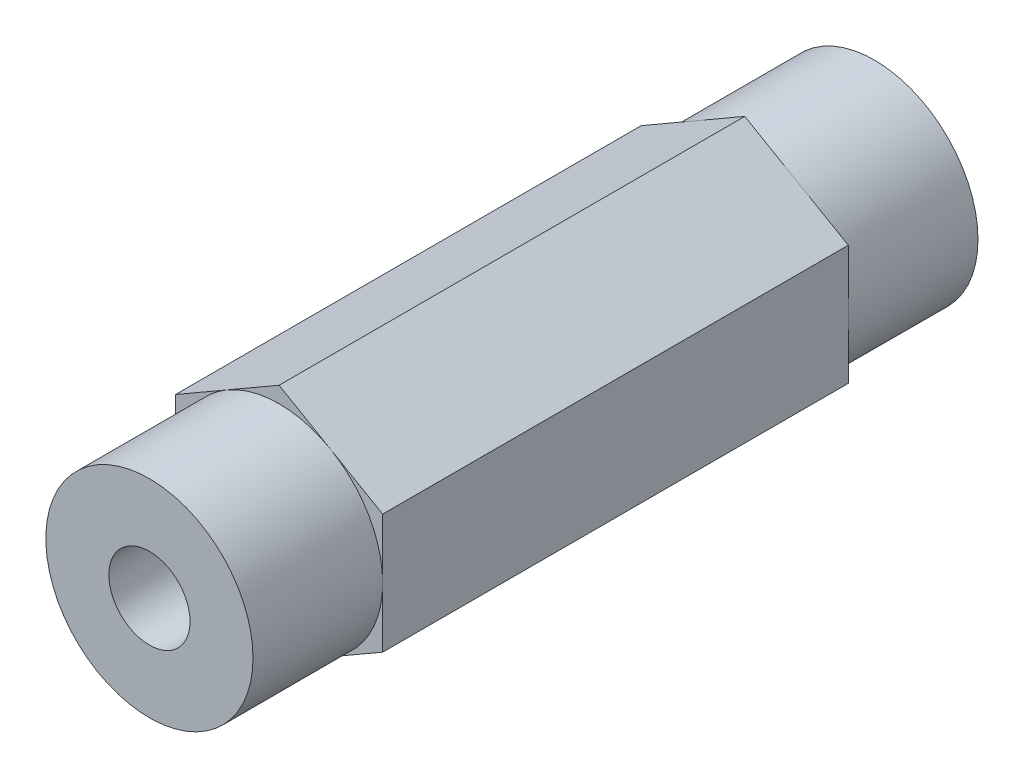
ISO-10303-21;
HEADER;
FILE_DESCRIPTION(('STEP AP214'),'2;1');
FILE_NAME('part.step','',(''),(''),'','','');
FILE_SCHEMA(('AUTOMOTIVE_DESIGN { 1 0 10303 214 1 1 1 1 }'));
ENDSEC;
DATA;
#1=APPLICATION_CONTEXT('core data for automotive mechanical design processes');
#2=APPLICATION_PROTOCOL_DEFINITION('international standard','automotive_design',2000,#1);
#3=PRODUCT_CONTEXT('',#1,'mechanical');
#4=PRODUCT('Part','Part','',(#3));
#5=PRODUCT_RELATED_PRODUCT_CATEGORY('part','',(#4));
#6=PRODUCT_DEFINITION_FORMATION('','',#4);
#7=PRODUCT_DEFINITION_CONTEXT('part definition',#1,'design');
#8=PRODUCT_DEFINITION('design','',#6,#7);
#9=PRODUCT_DEFINITION_SHAPE('','',#8);
#10=(LENGTH_UNIT() NAMED_UNIT(*) SI_UNIT(.MILLI.,.METRE.));
#11=(NAMED_UNIT(*) PLANE_ANGLE_UNIT() SI_UNIT($,.RADIAN.));
#12=(NAMED_UNIT(*) SI_UNIT($,.STERADIAN.) SOLID_ANGLE_UNIT());
#13=UNCERTAINTY_MEASURE_WITH_UNIT(LENGTH_MEASURE(1.E-05),#10,'distance_accuracy_value','');
#14=(GEOMETRIC_REPRESENTATION_CONTEXT(3) GLOBAL_UNCERTAINTY_ASSIGNED_CONTEXT((#13)) GLOBAL_UNIT_ASSIGNED_CONTEXT((#10,
#11,#12)) REPRESENTATION_CONTEXT('',''));
#15=CARTESIAN_POINT('',(0.,0.,0.));
#16=DIRECTION('',(0.,0.,1.));
#17=DIRECTION('',(1.,0.,0.));
#18=AXIS2_PLACEMENT_3D('',#15,#16,#17);
#19=CARTESIAN_POINT('',(0.,0.,-14.2748));
#20=DIRECTION('',(0.,0.,1.));
#21=DIRECTION('',(1.,0.,0.));
#22=AXIS2_PLACEMENT_3D('',#19,#20,#21);
#23=PLANE('',#22);
#24=DIRECTION('',(0.,1.,0.));
#25=VECTOR('',#24,1.);
#26=CARTESIAN_POINT('',(6.35,-3.66617420935413,-14.2748));
#27=LINE('',#26,#25);
#28=CARTESIAN_POINT('',(6.35,0.,-14.2748));
#29=VERTEX_POINT('',#28);
#30=CARTESIAN_POINT('',(6.35,3.66617420935412,-14.2748));
#31=VERTEX_POINT('',#30);
#32=EDGE_CURVE('E145',#29,#31,#27,.T.);
#33=ORIENTED_EDGE('',*,*,#32,.F.);
#34=CARTESIAN_POINT('',(0.,0.,-14.2748));
#35=DIRECTION('',(0.,0.,1.));
#36=DIRECTION('',(1.,0.,0.));
#37=AXIS2_PLACEMENT_3D('',#34,#35,#36);
#38=CIRCLE('',#37,6.35);
#39=CARTESIAN_POINT('',(3.175,5.49926131403119,-14.2748));
#40=VERTEX_POINT('',#39);
#41=EDGE_CURVE('E60',#29,#40,#38,.T.);
#42=ORIENTED_EDGE('',*,*,#41,.T.);
#43=DIRECTION('',(-0.866025403784439,0.5,0.));
#44=VECTOR('',#43,1.);
#45=CARTESIAN_POINT('',(6.35,3.66617420935412,-14.2748));
#46=LINE('',#45,#44);
#47=EDGE_CURVE('E144',#31,#40,#46,.T.);
#48=ORIENTED_EDGE('',*,*,#47,.F.);
#49=EDGE_LOOP('',(#33,#42,#48));
#50=FACE_BOUND('',#49,.T.);
#51=ADVANCED_FACE('F43',(#50),#23,.F.);
#52=CARTESIAN_POINT('',(0.,7.33234841870825,-14.2748));
#53=VERTEX_POINT('',#52);
#54=EDGE_CURVE('E150',#40,#53,#46,.T.);
#55=ORIENTED_EDGE('',*,*,#54,.F.);
#56=CARTESIAN_POINT('',(-3.175,5.49926131403119,-14.2748));
#57=VERTEX_POINT('',#56);
#58=EDGE_CURVE('E52',#40,#57,#38,.T.);
#59=ORIENTED_EDGE('',*,*,#58,.T.);
#60=DIRECTION('',(-0.866025403784439,-0.5,0.));
#61=VECTOR('',#60,1.);
#62=CARTESIAN_POINT('',(0.,7.33234841870825,-14.2748));
#63=LINE('',#62,#61);
#64=EDGE_CURVE('E153',#53,#57,#63,.T.);
#65=ORIENTED_EDGE('',*,*,#64,.F.);
#66=EDGE_LOOP('',(#55,#59,#65));
#67=FACE_BOUND('',#66,.T.);
#68=ADVANCED_FACE('F151',(#67),#23,.F.);
#69=CARTESIAN_POINT('',(-6.35,3.66617420935412,-14.2748));
#70=VERTEX_POINT('',#69);
#71=EDGE_CURVE('E163',#57,#70,#63,.T.);
#72=ORIENTED_EDGE('',*,*,#71,.F.);
#73=CARTESIAN_POINT('',(-6.35,0.,-14.2748));
#74=VERTEX_POINT('',#73);
#75=EDGE_CURVE('E134',#57,#74,#38,.T.);
#76=ORIENTED_EDGE('',*,*,#75,.T.);
#77=DIRECTION('',(0.,-1.,0.));
#78=VECTOR('',#77,1.);
#79=CARTESIAN_POINT('',(-6.35,3.66617420935412,-14.2748));
#80=LINE('',#79,#78);
#81=EDGE_CURVE('E170',#70,#74,#80,.T.);
#82=ORIENTED_EDGE('',*,*,#81,.F.);
#83=EDGE_LOOP('',(#72,#76,#82));
#84=FACE_BOUND('',#83,.T.);
#85=ADVANCED_FACE('F269',(#84),#23,.F.);
#86=CARTESIAN_POINT('',(-6.35,-3.66617420935412,-14.2748));
#87=VERTEX_POINT('',#86);
#88=EDGE_CURVE('E169',#74,#87,#80,.T.);
#89=ORIENTED_EDGE('',*,*,#88,.F.);
#90=CARTESIAN_POINT('',(-3.175,-5.49926131403118,-14.2748));
#91=VERTEX_POINT('',#90);
#92=EDGE_CURVE('E278',#74,#91,#38,.T.);
#93=ORIENTED_EDGE('',*,*,#92,.T.);
#94=DIRECTION('',(0.866025403784439,-0.5,0.));
#95=VECTOR('',#94,1.);
#96=CARTESIAN_POINT('',(-6.35,-3.66617420935412,-14.2748));
#97=LINE('',#96,#95);
#98=EDGE_CURVE('E174',#87,#91,#97,.T.);
#99=ORIENTED_EDGE('',*,*,#98,.F.);
#100=EDGE_LOOP('',(#89,#93,#99));
#101=FACE_BOUND('',#100,.T.);
#102=ADVANCED_FACE('F277',(#101),#23,.F.);
#103=CARTESIAN_POINT('',(0.,-7.33234841870825,-14.2748));
#104=VERTEX_POINT('',#103);
#105=EDGE_CURVE('E173',#91,#104,#97,.T.);
#106=ORIENTED_EDGE('',*,*,#105,.F.);
#107=CARTESIAN_POINT('',(3.175,-5.49926131403118,-14.2748));
#108=VERTEX_POINT('',#107);
#109=EDGE_CURVE('E220',#91,#108,#38,.T.);
#110=ORIENTED_EDGE('',*,*,#109,.T.);
#111=DIRECTION('',(0.866025403784439,0.5,0.));
#112=VECTOR('',#111,1.);
#113=CARTESIAN_POINT('',(0.,-7.33234841870825,-14.2748));
#114=LINE('',#113,#112);
#115=EDGE_CURVE('E178',#104,#108,#114,.T.);
#116=ORIENTED_EDGE('',*,*,#115,.F.);
#117=EDGE_LOOP('',(#106,#110,#116));
#118=FACE_BOUND('',#117,.T.);
#119=ADVANCED_FACE('F283',(#118),#23,.F.);
#120=CARTESIAN_POINT('',(0.,0.,14.2748));
#121=DIRECTION('',(0.,0.,1.));
#122=DIRECTION('',(1.,0.,0.));
#123=AXIS2_PLACEMENT_3D('',#120,#121,#122);
#124=PLANE('',#123);
#125=CARTESIAN_POINT('',(0.,0.,14.2748));
#126=DIRECTION('',(0.,0.,1.));
#127=DIRECTION('',(1.,0.,0.));
#128=AXIS2_PLACEMENT_3D('',#125,#126,#127);
#129=CIRCLE('',#128,6.35);
#130=CARTESIAN_POINT('',(6.35,0.,14.2748));
#131=VERTEX_POINT('',#130);
#132=CARTESIAN_POINT('',(3.175,5.49926131403119,14.2748));
#133=VERTEX_POINT('',#132);
#134=EDGE_CURVE('E203',#131,#133,#129,.T.);
#135=ORIENTED_EDGE('',*,*,#134,.F.);
#136=DIRECTION('',(0.,1.,0.));
#137=VECTOR('',#136,1.);
#138=CARTESIAN_POINT('',(6.35,-3.66617420935413,14.2748));
#139=LINE('',#138,#137);
#140=CARTESIAN_POINT('',(6.35,3.66617420935412,14.2748));
#141=VERTEX_POINT('',#140);
#142=EDGE_CURVE('E246',#131,#141,#139,.T.);
#143=ORIENTED_EDGE('',*,*,#142,.T.);
#144=DIRECTION('',(-0.866025403784439,0.5,0.));
#145=VECTOR('',#144,1.);
#146=CARTESIAN_POINT('',(6.35,3.66617420935412,14.2748));
#147=LINE('',#146,#145);
#148=EDGE_CURVE('E262',#141,#133,#147,.T.);
#149=ORIENTED_EDGE('',*,*,#148,.T.);
#150=EDGE_LOOP('',(#135,#143,#149));
#151=FACE_BOUND('',#150,.T.);
#152=ADVANCED_FACE('F261',(#151),#124,.T.);
#153=CARTESIAN_POINT('',(-3.175,5.49926131403118,14.2748));
#154=VERTEX_POINT('',#153);
#155=EDGE_CURVE('E211',#133,#154,#129,.T.);
#156=ORIENTED_EDGE('',*,*,#155,.F.);
#157=CARTESIAN_POINT('',(0.,7.33234841870825,14.2748));
#158=VERTEX_POINT('',#157);
#159=EDGE_CURVE('E183',#133,#158,#147,.T.);
#160=ORIENTED_EDGE('',*,*,#159,.T.);
#161=DIRECTION('',(-0.866025403784439,-0.5,0.));
#162=VECTOR('',#161,1.);
#163=CARTESIAN_POINT('',(0.,7.33234841870825,14.2748));
#164=LINE('',#163,#162);
#165=EDGE_CURVE('E234',#158,#154,#164,.T.);
#166=ORIENTED_EDGE('',*,*,#165,.T.);
#167=EDGE_LOOP('',(#156,#160,#166));
#168=FACE_BOUND('',#167,.T.);
#169=ADVANCED_FACE('F266',(#168),#124,.T.);
#170=CARTESIAN_POINT('',(-6.35,0.,14.2748));
#171=VERTEX_POINT('',#170);
#172=EDGE_CURVE('E218',#154,#171,#129,.T.);
#173=ORIENTED_EDGE('',*,*,#172,.F.);
#174=CARTESIAN_POINT('',(-6.35,3.66617420935412,14.2748));
#175=VERTEX_POINT('',#174);
#176=EDGE_CURVE('E239',#154,#175,#164,.T.);
#177=ORIENTED_EDGE('',*,*,#176,.T.);
#178=DIRECTION('',(0.,-1.,0.));
#179=VECTOR('',#178,1.);
#180=CARTESIAN_POINT('',(-6.35,3.66617420935412,14.2748));
#181=LINE('',#180,#179);
#182=EDGE_CURVE('E233',#175,#171,#181,.T.);
#183=ORIENTED_EDGE('',*,*,#182,.T.);
#184=EDGE_LOOP('',(#173,#177,#183));
#185=FACE_BOUND('',#184,.T.);
#186=ADVANCED_FACE('F237',(#185),#124,.T.);
#187=CARTESIAN_POINT('',(-3.175,-5.49926131403118,14.2748));
#188=VERTEX_POINT('',#187);
#189=EDGE_CURVE('E207',#171,#188,#129,.T.);
#190=ORIENTED_EDGE('',*,*,#189,.F.);
#191=CARTESIAN_POINT('',(-6.35,-3.66617420935412,14.2748));
#192=VERTEX_POINT('',#191);
#193=EDGE_CURVE('E227',#171,#192,#181,.T.);
#194=ORIENTED_EDGE('',*,*,#193,.T.);
#195=DIRECTION('',(0.866025403784439,-0.5,0.));
#196=VECTOR('',#195,1.);
#197=CARTESIAN_POINT('',(-6.35,-3.66617420935412,14.2748));
#198=LINE('',#197,#196);
#199=EDGE_CURVE('E230',#192,#188,#198,.T.);
#200=ORIENTED_EDGE('',*,*,#199,.T.);
#201=EDGE_LOOP('',(#190,#194,#200));
#202=FACE_BOUND('',#201,.T.);
#203=ADVANCED_FACE('F226',(#202),#124,.T.);
#204=CARTESIAN_POINT('',(3.175,-5.49926131403119,14.2748));
#205=VERTEX_POINT('',#204);
#206=EDGE_CURVE('E201',#188,#205,#129,.T.);
#207=ORIENTED_EDGE('',*,*,#206,.F.);
#208=CARTESIAN_POINT('',(0.,-7.33234841870825,14.2748));
#209=VERTEX_POINT('',#208);
#210=EDGE_CURVE('E240',#188,#209,#198,.T.);
#211=ORIENTED_EDGE('',*,*,#210,.T.);
#212=DIRECTION('',(0.866025403784439,0.5,0.));
#213=VECTOR('',#212,1.);
#214=CARTESIAN_POINT('',(0.,-7.33234841870825,14.2748));
#215=LINE('',#214,#213);
#216=EDGE_CURVE('E244',#209,#205,#215,.T.);
#217=ORIENTED_EDGE('',*,*,#216,.T.);
#218=EDGE_LOOP('',(#207,#211,#217));
#219=FACE_BOUND('',#218,.T.);
#220=ADVANCED_FACE('F285',(#219),#124,.T.);
#221=CARTESIAN_POINT('',(6.35,3.66617420935412,14.2748));
#222=DIRECTION('',(-0.5,-0.866025403784439,0.));
#223=DIRECTION('',(0.866025403784439,-0.5,0.));
#224=AXIS2_PLACEMENT_3D('',#221,#222,#223);
#225=PLANE('',#224);
#226=ORIENTED_EDGE('',*,*,#47,.T.);
#227=ORIENTED_EDGE('',*,*,#54,.T.);
#228=DIRECTION('',(0.,0.,-1.));
#229=VECTOR('',#228,1.);
#230=CARTESIAN_POINT('',(0.,7.33234841870825,14.2748));
#231=LINE('',#230,#229);
#232=EDGE_CURVE('E47',#158,#53,#231,.T.);
#233=ORIENTED_EDGE('',*,*,#232,.F.);
#234=ORIENTED_EDGE('',*,*,#159,.F.);
#235=ORIENTED_EDGE('',*,*,#148,.F.);
#236=DIRECTION('',(0.,0.,-1.));
#237=VECTOR('',#236,1.);
#238=CARTESIAN_POINT('',(6.35,3.66617420935412,14.2748));
#239=LINE('',#238,#237);
#240=EDGE_CURVE('E162',#141,#31,#239,.T.);
#241=ORIENTED_EDGE('',*,*,#240,.T.);
#242=EDGE_LOOP('',(#226,#227,#233,#234,#235,#241));
#243=FACE_BOUND('',#242,.T.);
#244=ADVANCED_FACE('F45',(#243),#225,.F.);
#245=CARTESIAN_POINT('',(0.,7.33234841870825,14.2748));
#246=DIRECTION('',(0.5,-0.866025403784439,0.));
#247=DIRECTION('',(0.866025403784439,0.5,0.));
#248=AXIS2_PLACEMENT_3D('',#245,#246,#247);
#249=PLANE('',#248);
#250=ORIENTED_EDGE('',*,*,#64,.T.);
#251=ORIENTED_EDGE('',*,*,#71,.T.);
#252=DIRECTION('',(0.,0.,-1.));
#253=VECTOR('',#252,1.);
#254=CARTESIAN_POINT('',(-6.35,3.66617420935412,14.2748));
#255=LINE('',#254,#253);
#256=EDGE_CURVE('E193',#175,#70,#255,.T.);
#257=ORIENTED_EDGE('',*,*,#256,.F.);
#258=ORIENTED_EDGE('',*,*,#176,.F.);
#259=ORIENTED_EDGE('',*,*,#165,.F.);
#260=ORIENTED_EDGE('',*,*,#232,.T.);
#261=EDGE_LOOP('',(#250,#251,#257,#258,#259,#260));
#262=FACE_BOUND('',#261,.T.);
#263=ADVANCED_FACE('F267',(#262),#249,.F.);
#264=CARTESIAN_POINT('',(-6.35,3.66617420935412,14.2748));
#265=DIRECTION('',(1.,0.,0.));
#266=DIRECTION('',(0.,1.,0.));
#267=AXIS2_PLACEMENT_3D('',#264,#265,#266);
#268=PLANE('',#267);
#269=ORIENTED_EDGE('',*,*,#81,.T.);
#270=ORIENTED_EDGE('',*,*,#88,.T.);
#271=DIRECTION('',(0.,0.,-1.));
#272=VECTOR('',#271,1.);
#273=CARTESIAN_POINT('',(-6.35,-3.66617420935412,14.2748));
#274=LINE('',#273,#272);
#275=EDGE_CURVE('E191',#192,#87,#274,.T.);
#276=ORIENTED_EDGE('',*,*,#275,.F.);
#277=ORIENTED_EDGE('',*,*,#193,.F.);
#278=ORIENTED_EDGE('',*,*,#182,.F.);
#279=ORIENTED_EDGE('',*,*,#256,.T.);
#280=EDGE_LOOP('',(#269,#270,#276,#277,#278,#279));
#281=FACE_BOUND('',#280,.T.);
#282=ADVANCED_FACE('F232',(#281),#268,.F.);
#283=CARTESIAN_POINT('',(-6.35,-3.66617420935412,14.2748));
#284=DIRECTION('',(0.5,0.866025403784439,0.));
#285=DIRECTION('',(-0.866025403784439,0.5,0.));
#286=AXIS2_PLACEMENT_3D('',#283,#284,#285);
#287=PLANE('',#286);
#288=ORIENTED_EDGE('',*,*,#98,.T.);
#289=ORIENTED_EDGE('',*,*,#105,.T.);
#290=DIRECTION('',(0.,0.,-1.));
#291=VECTOR('',#290,1.);
#292=CARTESIAN_POINT('',(0.,-7.33234841870825,14.2748));
#293=LINE('',#292,#291);
#294=EDGE_CURVE('E188',#209,#104,#293,.T.);
#295=ORIENTED_EDGE('',*,*,#294,.F.);
#296=ORIENTED_EDGE('',*,*,#210,.F.);
#297=ORIENTED_EDGE('',*,*,#199,.F.);
#298=ORIENTED_EDGE('',*,*,#275,.T.);
#299=EDGE_LOOP('',(#288,#289,#295,#296,#297,#298));
#300=FACE_BOUND('',#299,.T.);
#301=ADVANCED_FACE('F275',(#300),#287,.F.);
#302=CARTESIAN_POINT('',(0.,-7.33234841870825,14.2748));
#303=DIRECTION('',(-0.5,0.866025403784438,0.));
#304=DIRECTION('',(-0.866025403784439,-0.5,0.));
#305=AXIS2_PLACEMENT_3D('',#302,#303,#304);
#306=PLANE('',#305);
#307=ORIENTED_EDGE('',*,*,#115,.T.);
#308=CARTESIAN_POINT('',(6.35,-3.66617420935413,-14.2748));
#309=VERTEX_POINT('',#308);
#310=EDGE_CURVE('E177',#108,#309,#114,.T.);
#311=ORIENTED_EDGE('',*,*,#310,.T.);
#312=DIRECTION('',(0.,0.,-1.));
#313=VECTOR('',#312,1.);
#314=CARTESIAN_POINT('',(6.35,-3.66617420935413,14.2748));
#315=LINE('',#314,#313);
#316=CARTESIAN_POINT('',(6.35,-3.66617420935413,14.2748));
#317=VERTEX_POINT('',#316);
#318=EDGE_CURVE('E185',#317,#309,#315,.T.);
#319=ORIENTED_EDGE('',*,*,#318,.F.);
#320=EDGE_CURVE('E243',#205,#317,#215,.T.);
#321=ORIENTED_EDGE('',*,*,#320,.F.);
#322=ORIENTED_EDGE('',*,*,#216,.F.);
#323=ORIENTED_EDGE('',*,*,#294,.T.);
#324=EDGE_LOOP('',(#307,#311,#319,#321,#322,#323));
#325=FACE_BOUND('',#324,.T.);
#326=ADVANCED_FACE('F254',(#325),#306,.F.);
#327=CARTESIAN_POINT('',(6.35,-3.66617420935413,14.2748));
#328=DIRECTION('',(-1.,0.,0.));
#329=DIRECTION('',(0.,-1.,0.));
#330=AXIS2_PLACEMENT_3D('',#327,#328,#329);
#331=PLANE('',#330);
#332=EDGE_CURVE('E181',#309,#29,#27,.T.);
#333=ORIENTED_EDGE('',*,*,#332,.T.);
#334=ORIENTED_EDGE('',*,*,#32,.T.);
#335=ORIENTED_EDGE('',*,*,#240,.F.);
#336=ORIENTED_EDGE('',*,*,#142,.F.);
#337=EDGE_CURVE('E166',#317,#131,#139,.T.);
#338=ORIENTED_EDGE('',*,*,#337,.F.);
#339=ORIENTED_EDGE('',*,*,#318,.T.);
#340=EDGE_LOOP('',(#333,#334,#335,#336,#338,#339));
#341=FACE_BOUND('',#340,.T.);
#342=ADVANCED_FACE('F258',(#341),#331,.F.);
#343=EDGE_CURVE('E68',#205,#131,#129,.T.);
#344=ORIENTED_EDGE('',*,*,#343,.F.);
#345=ORIENTED_EDGE('',*,*,#320,.T.);
#346=ORIENTED_EDGE('',*,*,#337,.T.);
#347=EDGE_LOOP('',(#344,#345,#346));
#348=FACE_BOUND('',#347,.T.);
#349=ADVANCED_FACE('F250',(#348),#124,.T.);
#350=ORIENTED_EDGE('',*,*,#310,.F.);
#351=EDGE_CURVE('E149',#108,#29,#38,.T.);
#352=ORIENTED_EDGE('',*,*,#351,.T.);
#353=ORIENTED_EDGE('',*,*,#332,.F.);
#354=EDGE_LOOP('',(#350,#352,#353));
#355=FACE_BOUND('',#354,.T.);
#356=ADVANCED_FACE('F304',(#355),#23,.F.);
#357=CARTESIAN_POINT('',(0.,0.,22.225));
#358=DIRECTION('',(0.,0.,1.));
#359=DIRECTION('',(1.,0.,0.));
#360=AXIS2_PLACEMENT_3D('',#357,#358,#359);
#361=PLANE('',#360);
#362=CARTESIAN_POINT('',(0.,0.,22.225));
#363=DIRECTION('',(0.,0.,1.));
#364=DIRECTION('',(1.,0.,0.));
#365=AXIS2_PLACEMENT_3D('',#362,#363,#364);
#366=CIRCLE('',#365,6.35);
#367=CARTESIAN_POINT('',(6.35,0.,22.225));
#368=VERTEX_POINT('',#367);
#369=EDGE_CURVE('E157',#368,#368,#366,.T.);
#370=ORIENTED_EDGE('',*,*,#369,.T.);
#371=EDGE_LOOP('',(#370));
#372=FACE_BOUND('',#371,.T.);
#373=CARTESIAN_POINT('',(0.,0.,22.225));
#374=DIRECTION('',(0.,0.,1.));
#375=DIRECTION('',(1.,0.,0.));
#376=AXIS2_PLACEMENT_3D('',#373,#374,#375);
#377=CIRCLE('',#376,2.4892);
#378=CARTESIAN_POINT('',(2.4892,0.,22.225));
#379=VERTEX_POINT('',#378);
#380=EDGE_CURVE('E210',#379,#379,#377,.T.);
#381=ORIENTED_EDGE('',*,*,#380,.F.);
#382=EDGE_LOOP('',(#381));
#383=FACE_BOUND('',#382,.T.);
#384=ADVANCED_FACE('F317',(#372,#383),#361,.T.);
#385=CARTESIAN_POINT('',(0.,0.,22.225));
#386=DIRECTION('',(0.,0.,-1.));
#387=DIRECTION('',(-1.,0.,0.));
#388=AXIS2_PLACEMENT_3D('',#385,#386,#387);
#389=CYLINDRICAL_SURFACE('',#388,6.35);
#390=ORIENTED_EDGE('',*,*,#369,.F.);
#391=EDGE_LOOP('',(#390));
#392=FACE_BOUND('',#391,.T.);
#393=ORIENTED_EDGE('',*,*,#134,.T.);
#394=ORIENTED_EDGE('',*,*,#155,.T.);
#395=ORIENTED_EDGE('',*,*,#172,.T.);
#396=ORIENTED_EDGE('',*,*,#189,.T.);
#397=ORIENTED_EDGE('',*,*,#206,.T.);
#398=ORIENTED_EDGE('',*,*,#343,.T.);
#399=EDGE_LOOP('',(#393,#394,#395,#396,#397,#398));
#400=FACE_BOUND('',#399,.T.);
#401=ADVANCED_FACE('F222',(#392,#400),#389,.T.);
#402=CARTESIAN_POINT('',(0.,0.,22.225));
#403=DIRECTION('',(0.,0.,-1.));
#404=DIRECTION('',(-1.,0.,0.));
#405=AXIS2_PLACEMENT_3D('',#402,#403,#404);
#406=CYLINDRICAL_SURFACE('',#405,2.4892);
#407=ORIENTED_EDGE('',*,*,#380,.T.);
#408=EDGE_LOOP('',(#407));
#409=FACE_BOUND('',#408,.T.);
#410=CARTESIAN_POINT('',(0.,0.,14.2748));
#411=DIRECTION('',(0.,0.,1.));
#412=DIRECTION('',(1.,0.,0.));
#413=AXIS2_PLACEMENT_3D('',#410,#411,#412);
#414=CIRCLE('',#413,2.4892);
#415=CARTESIAN_POINT('',(2.4892,0.,14.2748));
#416=VERTEX_POINT('',#415);
#417=EDGE_CURVE('E216',#416,#416,#414,.T.);
#418=ORIENTED_EDGE('',*,*,#417,.F.);
#419=EDGE_LOOP('',(#418));
#420=FACE_BOUND('',#419,.T.);
#421=ADVANCED_FACE('F297',(#409,#420),#406,.F.);
#422=ORIENTED_EDGE('',*,*,#417,.T.);
#423=EDGE_LOOP('',(#422));
#424=FACE_BOUND('',#423,.T.);
#425=ADVANCED_FACE('F288',(#424),#124,.T.);
#426=CARTESIAN_POINT('',(0.,0.,-22.225));
#427=DIRECTION('',(0.,0.,1.));
#428=DIRECTION('',(1.,0.,0.));
#429=AXIS2_PLACEMENT_3D('',#426,#427,#428);
#430=CYLINDRICAL_SURFACE('',#429,6.35);
#431=CARTESIAN_POINT('',(0.,0.,-22.225));
#432=DIRECTION('',(0.,0.,1.));
#433=DIRECTION('',(1.,0.,0.));
#434=AXIS2_PLACEMENT_3D('',#431,#432,#433);
#435=CIRCLE('',#434,6.35);
#436=CARTESIAN_POINT('',(6.35,0.,-22.225));
#437=VERTEX_POINT('',#436);
#438=EDGE_CURVE('E147',#437,#437,#435,.T.);
#439=ORIENTED_EDGE('',*,*,#438,.T.);
#440=EDGE_LOOP('',(#439));
#441=FACE_BOUND('',#440,.T.);
#442=ORIENTED_EDGE('',*,*,#41,.F.);
#443=ORIENTED_EDGE('',*,*,#351,.F.);
#444=ORIENTED_EDGE('',*,*,#109,.F.);
#445=ORIENTED_EDGE('',*,*,#92,.F.);
#446=ORIENTED_EDGE('',*,*,#75,.F.);
#447=ORIENTED_EDGE('',*,*,#58,.F.);
#448=EDGE_LOOP('',(#442,#443,#444,#445,#446,#447));
#449=FACE_BOUND('',#448,.T.);
#450=ADVANCED_FACE('F132',(#441,#449),#430,.T.);
#451=CARTESIAN_POINT('',(0.,0.,-22.225));
#452=DIRECTION('',(0.,0.,-1.));
#453=DIRECTION('',(1.,0.,0.));
#454=AXIS2_PLACEMENT_3D('',#451,#452,#453);
#455=PLANE('',#454);
#456=CARTESIAN_POINT('',(0.,0.,-22.225));
#457=DIRECTION('',(0.,0.,1.));
#458=DIRECTION('',(1.,0.,0.));
#459=AXIS2_PLACEMENT_3D('',#456,#457,#458);
#460=CIRCLE('',#459,2.4892);
#461=CARTESIAN_POINT('',(2.4892,0.,-22.225));
#462=VERTEX_POINT('',#461);
#463=EDGE_CURVE('E148',#462,#462,#460,.T.);
#464=ORIENTED_EDGE('',*,*,#463,.T.);
#465=EDGE_LOOP('',(#464));
#466=FACE_BOUND('',#465,.T.);
#467=ORIENTED_EDGE('',*,*,#438,.F.);
#468=EDGE_LOOP('',(#467));
#469=FACE_BOUND('',#468,.T.);
#470=ADVANCED_FACE('F312',(#466,#469),#455,.T.);
#471=CARTESIAN_POINT('',(0.,0.,-22.225));
#472=DIRECTION('',(0.,0.,1.));
#473=DIRECTION('',(1.,0.,0.));
#474=AXIS2_PLACEMENT_3D('',#471,#472,#473);
#475=CYLINDRICAL_SURFACE('',#474,2.4892);
#476=ORIENTED_EDGE('',*,*,#463,.F.);
#477=EDGE_LOOP('',(#476));
#478=FACE_BOUND('',#477,.T.);
#479=CARTESIAN_POINT('',(0.,0.,-14.2748));
#480=DIRECTION('',(0.,0.,1.));
#481=DIRECTION('',(1.,0.,0.));
#482=AXIS2_PLACEMENT_3D('',#479,#480,#481);
#483=CIRCLE('',#482,2.4892);
#484=CARTESIAN_POINT('',(2.4892,0.,-14.2748));
#485=VERTEX_POINT('',#484);
#486=EDGE_CURVE('E11',#485,#485,#483,.T.);
#487=ORIENTED_EDGE('',*,*,#486,.T.);
#488=EDGE_LOOP('',(#487));
#489=FACE_BOUND('',#488,.T.);
#490=ADVANCED_FACE('F307',(#478,#489),#475,.F.);
#491=ORIENTED_EDGE('',*,*,#486,.F.);
#492=EDGE_LOOP('',(#491));
#493=FACE_BOUND('',#492,.T.);
#494=ADVANCED_FACE('F300',(#493),#23,.F.);
#495=CLOSED_SHELL('',(#51,#68,#85,#102,#119,#152,#169,#186,#203,#220,#244,#263,#282,#301,#326,
#342,#349,#356,#384,#401,#421,#425,#450,#470,#490,#494));
#496=MANIFOLD_SOLID_BREP('B2',#495);
#497=ADVANCED_BREP_SHAPE_REPRESENTATION('',(#18,#496),#14);
#498=SHAPE_DEFINITION_REPRESENTATION(#9,#497);
ENDSEC;
END-ISO-10303-21;
